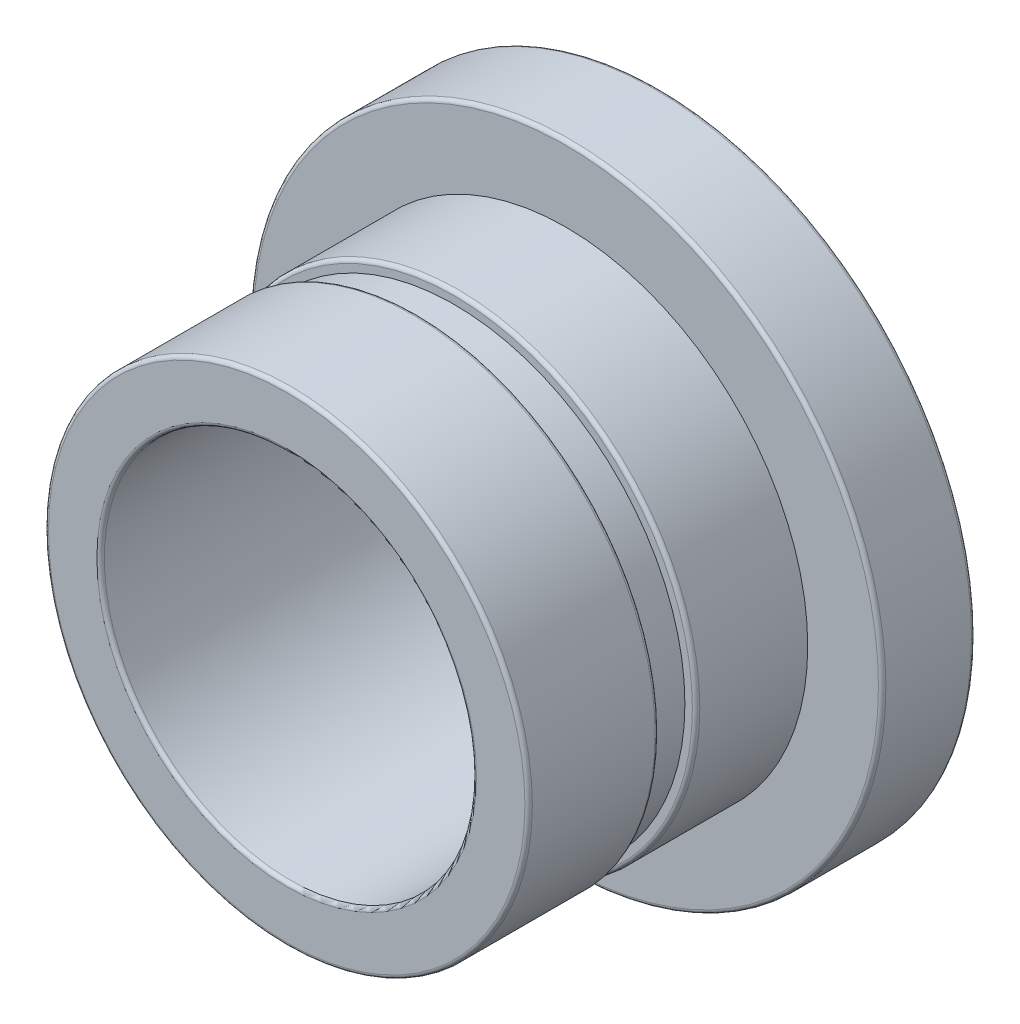
ISO-10303-21;
HEADER;
FILE_DESCRIPTION(('STEP AP214'),'2;1');
FILE_NAME('part.step','',(''),(''),'','','');
FILE_SCHEMA(('AUTOMOTIVE_DESIGN { 1 0 10303 214 1 1 1 1 }'));
ENDSEC;
DATA;
#1=APPLICATION_CONTEXT('core data for automotive mechanical design processes');
#2=APPLICATION_PROTOCOL_DEFINITION('international standard','automotive_design',2000,#1);
#3=PRODUCT_CONTEXT('',#1,'mechanical');
#4=PRODUCT('Part','Part','',(#3));
#5=PRODUCT_RELATED_PRODUCT_CATEGORY('part','',(#4));
#6=PRODUCT_DEFINITION_FORMATION('','',#4);
#7=PRODUCT_DEFINITION_CONTEXT('part definition',#1,'design');
#8=PRODUCT_DEFINITION('design','',#6,#7);
#9=PRODUCT_DEFINITION_SHAPE('','',#8);
#10=(LENGTH_UNIT() NAMED_UNIT(*) SI_UNIT(.MILLI.,.METRE.));
#11=(NAMED_UNIT(*) PLANE_ANGLE_UNIT() SI_UNIT($,.RADIAN.));
#12=(NAMED_UNIT(*) SI_UNIT($,.STERADIAN.) SOLID_ANGLE_UNIT());
#13=UNCERTAINTY_MEASURE_WITH_UNIT(LENGTH_MEASURE(1.E-05),#10,'distance_accuracy_value','');
#14=(GEOMETRIC_REPRESENTATION_CONTEXT(3) GLOBAL_UNCERTAINTY_ASSIGNED_CONTEXT((#13)) GLOBAL_UNIT_ASSIGNED_CONTEXT((#10,
#11,#12)) REPRESENTATION_CONTEXT('',''));
#15=CARTESIAN_POINT('',(0.,0.,0.));
#16=DIRECTION('',(0.,0.,1.));
#17=DIRECTION('',(1.,0.,0.));
#18=AXIS2_PLACEMENT_3D('',#15,#16,#17);
#19=CARTESIAN_POINT('',(0.,0.,10.));
#20=DIRECTION('',(0.,0.,-1.));
#21=DIRECTION('',(-1.,0.,0.));
#22=AXIS2_PLACEMENT_3D('',#19,#20,#21);
#23=CYLINDRICAL_SURFACE('',#22,6.5);
#24=CARTESIAN_POINT('',(0.,0.,5.4));
#25=DIRECTION('',(0.,0.,1.));
#26=DIRECTION('',(1.,0.,0.));
#27=AXIS2_PLACEMENT_3D('',#24,#25,#26);
#28=CIRCLE('',#27,6.5);
#29=CARTESIAN_POINT('',(6.5,0.,5.4));
#30=VERTEX_POINT('',#29);
#31=EDGE_CURVE('E10',#30,#30,#28,.F.);
#32=ORIENTED_EDGE('',*,*,#31,.T.);
#33=EDGE_LOOP('',(#32));
#34=FACE_BOUND('',#33,.T.);
#35=CARTESIAN_POINT('',(0.,0.,2.5));
#36=DIRECTION('',(0.,0.,1.));
#37=DIRECTION('',(1.,0.,0.));
#38=AXIS2_PLACEMENT_3D('',#35,#36,#37);
#39=CIRCLE('',#38,6.5);
#40=CARTESIAN_POINT('',(6.5,0.,2.5));
#41=VERTEX_POINT('',#40);
#42=EDGE_CURVE('E74',#41,#41,#39,.T.);
#43=ORIENTED_EDGE('',*,*,#42,.T.);
#44=EDGE_LOOP('',(#43));
#45=FACE_BOUND('',#44,.T.);
#46=ADVANCED_FACE('F24',(#34,#45),#23,.T.);
#47=CARTESIAN_POINT('',(0.,0.,2.5));
#48=DIRECTION('',(0.,0.,1.));
#49=DIRECTION('',(1.,0.,0.));
#50=AXIS2_PLACEMENT_3D('',#47,#48,#49);
#51=PLANE('',#50);
#52=CARTESIAN_POINT('',(0.,0.,2.5));
#53=DIRECTION('',(0.,0.,1.));
#54=DIRECTION('',(1.,0.,0.));
#55=AXIS2_PLACEMENT_3D('',#52,#53,#54);
#56=CIRCLE('',#55,8.4);
#57=CARTESIAN_POINT('',(8.4,0.,2.5));
#58=VERTEX_POINT('',#57);
#59=EDGE_CURVE('E59',#58,#58,#56,.T.);
#60=ORIENTED_EDGE('',*,*,#59,.T.);
#61=EDGE_LOOP('',(#60));
#62=FACE_BOUND('',#61,.T.);
#63=ORIENTED_EDGE('',*,*,#42,.F.);
#64=EDGE_LOOP('',(#63));
#65=FACE_BOUND('',#64,.T.);
#66=ADVANCED_FACE('F103',(#62,#65),#51,.T.);
#67=CARTESIAN_POINT('',(0.,0.,2.5));
#68=DIRECTION('',(0.,0.,-1.));
#69=DIRECTION('',(-1.,0.,0.));
#70=AXIS2_PLACEMENT_3D('',#67,#68,#69);
#71=CYLINDRICAL_SURFACE('',#70,8.5);
#72=CARTESIAN_POINT('',(0.,0.,0.0999999999999998));
#73=DIRECTION('',(0.,0.,1.));
#74=DIRECTION('',(1.,0.,0.));
#75=AXIS2_PLACEMENT_3D('',#72,#73,#74);
#76=CIRCLE('',#75,8.5);
#77=CARTESIAN_POINT('',(8.5,0.,0.0999999999999998));
#78=VERTEX_POINT('',#77);
#79=EDGE_CURVE('E68',#78,#78,#76,.T.);
#80=ORIENTED_EDGE('',*,*,#79,.T.);
#81=EDGE_LOOP('',(#80));
#82=FACE_BOUND('',#81,.T.);
#83=CARTESIAN_POINT('',(0.,0.,2.4));
#84=DIRECTION('',(0.,0.,1.));
#85=DIRECTION('',(1.,0.,0.));
#86=AXIS2_PLACEMENT_3D('',#83,#84,#85);
#87=CIRCLE('',#86,8.5);
#88=CARTESIAN_POINT('',(8.5,0.,2.4));
#89=VERTEX_POINT('',#88);
#90=EDGE_CURVE('E71',#89,#89,#87,.F.);
#91=ORIENTED_EDGE('',*,*,#90,.T.);
#92=EDGE_LOOP('',(#91));
#93=FACE_BOUND('',#92,.T.);
#94=ADVANCED_FACE('F26',(#82,#93),#71,.T.);
#95=CARTESIAN_POINT('',(0.,0.,0.));
#96=DIRECTION('',(0.,0.,1.));
#97=DIRECTION('',(1.,0.,0.));
#98=AXIS2_PLACEMENT_3D('',#95,#96,#97);
#99=PLANE('',#98);
#100=CARTESIAN_POINT('',(0.,0.,0.));
#101=DIRECTION('',(0.,0.,1.));
#102=DIRECTION('',(1.,0.,0.));
#103=AXIS2_PLACEMENT_3D('',#100,#101,#102);
#104=CIRCLE('',#103,8.4);
#105=CARTESIAN_POINT('',(8.4,0.,0.));
#106=VERTEX_POINT('',#105);
#107=EDGE_CURVE('E62',#106,#106,#104,.F.);
#108=ORIENTED_EDGE('',*,*,#107,.T.);
#109=EDGE_LOOP('',(#108));
#110=FACE_BOUND('',#109,.T.);
#111=CARTESIAN_POINT('',(0.,0.,0.));
#112=DIRECTION('',(0.,0.,1.));
#113=DIRECTION('',(1.,0.,0.));
#114=AXIS2_PLACEMENT_3D('',#111,#112,#113);
#115=CIRCLE('',#114,5.1);
#116=CARTESIAN_POINT('',(5.1,0.,0.));
#117=VERTEX_POINT('',#116);
#118=EDGE_CURVE('E65',#117,#117,#115,.T.);
#119=ORIENTED_EDGE('',*,*,#118,.T.);
#120=EDGE_LOOP('',(#119));
#121=FACE_BOUND('',#120,.T.);
#122=ADVANCED_FACE('F115',(#110,#121),#99,.F.);
#123=CARTESIAN_POINT('',(0.,0.,6.6));
#124=DIRECTION('',(0.,0.,1.));
#125=DIRECTION('',(1.,0.,0.));
#126=AXIS2_PLACEMENT_3D('',#123,#124,#125);
#127=CIRCLE('',#126,6.5);
#128=CARTESIAN_POINT('',(6.5,0.,6.6));
#129=VERTEX_POINT('',#128);
#130=EDGE_CURVE('E39',#129,#129,#127,.T.);
#131=ORIENTED_EDGE('',*,*,#130,.T.);
#132=EDGE_LOOP('',(#131));
#133=FACE_BOUND('',#132,.T.);
#134=CARTESIAN_POINT('',(0.,0.,9.9));
#135=DIRECTION('',(0.,0.,1.));
#136=DIRECTION('',(1.,0.,0.));
#137=AXIS2_PLACEMENT_3D('',#134,#135,#136);
#138=CIRCLE('',#137,6.5);
#139=CARTESIAN_POINT('',(6.5,0.,9.9));
#140=VERTEX_POINT('',#139);
#141=EDGE_CURVE('E50',#140,#140,#138,.F.);
#142=ORIENTED_EDGE('',*,*,#141,.T.);
#143=EDGE_LOOP('',(#142));
#144=FACE_BOUND('',#143,.T.);
#145=ADVANCED_FACE('F105',(#133,#144),#23,.T.);
#146=CARTESIAN_POINT('',(0.,0.,10.));
#147=DIRECTION('',(0.,0.,1.));
#148=DIRECTION('',(1.,0.,0.));
#149=AXIS2_PLACEMENT_3D('',#146,#147,#148);
#150=PLANE('',#149);
#151=CARTESIAN_POINT('',(0.,0.,10.));
#152=DIRECTION('',(0.,0.,1.));
#153=DIRECTION('',(1.,0.,0.));
#154=AXIS2_PLACEMENT_3D('',#151,#152,#153);
#155=CIRCLE('',#154,6.4);
#156=CARTESIAN_POINT('',(6.4,0.,10.));
#157=VERTEX_POINT('',#156);
#158=EDGE_CURVE('E53',#157,#157,#155,.T.);
#159=ORIENTED_EDGE('',*,*,#158,.T.);
#160=EDGE_LOOP('',(#159));
#161=FACE_BOUND('',#160,.T.);
#162=CARTESIAN_POINT('',(0.,0.,10.));
#163=DIRECTION('',(0.,0.,1.));
#164=DIRECTION('',(1.,0.,0.));
#165=AXIS2_PLACEMENT_3D('',#162,#163,#164);
#166=CIRCLE('',#165,5.1);
#167=CARTESIAN_POINT('',(5.1,0.,10.));
#168=VERTEX_POINT('',#167);
#169=EDGE_CURVE('E56',#168,#168,#166,.F.);
#170=ORIENTED_EDGE('',*,*,#169,.T.);
#171=EDGE_LOOP('',(#170));
#172=FACE_BOUND('',#171,.T.);
#173=ADVANCED_FACE('F114',(#161,#172),#150,.T.);
#174=CARTESIAN_POINT('',(0.,0.,0.));
#175=DIRECTION('',(0.,0.,1.));
#176=DIRECTION('',(1.,0.,0.));
#177=AXIS2_PLACEMENT_3D('',#174,#175,#176);
#178=CYLINDRICAL_SURFACE('',#177,5.);
#179=CARTESIAN_POINT('',(0.,0.,9.9));
#180=DIRECTION('',(0.,0.,1.));
#181=DIRECTION('',(1.,0.,0.));
#182=AXIS2_PLACEMENT_3D('',#179,#180,#181);
#183=CIRCLE('',#182,5.);
#184=CARTESIAN_POINT('',(5.,0.,9.9));
#185=VERTEX_POINT('',#184);
#186=EDGE_CURVE('E44',#185,#185,#183,.T.);
#187=ORIENTED_EDGE('',*,*,#186,.T.);
#188=EDGE_LOOP('',(#187));
#189=FACE_BOUND('',#188,.T.);
#190=CARTESIAN_POINT('',(0.,0.,0.1));
#191=DIRECTION('',(0.,0.,1.));
#192=DIRECTION('',(1.,0.,0.));
#193=AXIS2_PLACEMENT_3D('',#190,#191,#192);
#194=CIRCLE('',#193,5.);
#195=CARTESIAN_POINT('',(5.,0.,0.1));
#196=VERTEX_POINT('',#195);
#197=EDGE_CURVE('E47',#196,#196,#194,.F.);
#198=ORIENTED_EDGE('',*,*,#197,.T.);
#199=EDGE_LOOP('',(#198));
#200=FACE_BOUND('',#199,.T.);
#201=ADVANCED_FACE('F121',(#189,#200),#178,.F.);
#202=CARTESIAN_POINT('',(0.,0.,0.0999999999999998));
#203=DIRECTION('',(0.,0.,1.));
#204=DIRECTION('',(1.,0.,0.));
#205=AXIS2_PLACEMENT_3D('',#202,#203,#204);
#206=TOROIDAL_SURFACE('',#205,8.4,0.1);
#207=ORIENTED_EDGE('',*,*,#107,.F.);
#208=EDGE_LOOP('',(#207));
#209=FACE_BOUND('',#208,.T.);
#210=ORIENTED_EDGE('',*,*,#79,.F.);
#211=EDGE_LOOP('',(#210));
#212=FACE_BOUND('',#211,.T.);
#213=ADVANCED_FACE('F147',(#209,#212),#206,.T.);
#214=CARTESIAN_POINT('',(0.,0.,2.4));
#215=DIRECTION('',(0.,0.,1.));
#216=DIRECTION('',(1.,0.,0.));
#217=AXIS2_PLACEMENT_3D('',#214,#215,#216);
#218=TOROIDAL_SURFACE('',#217,8.4,0.1);
#219=ORIENTED_EDGE('',*,*,#90,.F.);
#220=EDGE_LOOP('',(#219));
#221=FACE_BOUND('',#220,.T.);
#222=ORIENTED_EDGE('',*,*,#59,.F.);
#223=EDGE_LOOP('',(#222));
#224=FACE_BOUND('',#223,.T.);
#225=ADVANCED_FACE('F133',(#221,#224),#218,.T.);
#226=CARTESIAN_POINT('',(0.,0.,9.9));
#227=DIRECTION('',(0.,0.,1.));
#228=DIRECTION('',(1.,0.,0.));
#229=AXIS2_PLACEMENT_3D('',#226,#227,#228);
#230=TOROIDAL_SURFACE('',#229,6.4,0.1);
#231=ORIENTED_EDGE('',*,*,#141,.F.);
#232=EDGE_LOOP('',(#231));
#233=FACE_BOUND('',#232,.T.);
#234=ORIENTED_EDGE('',*,*,#158,.F.);
#235=EDGE_LOOP('',(#234));
#236=FACE_BOUND('',#235,.T.);
#237=ADVANCED_FACE('F129',(#233,#236),#230,.T.);
#238=CARTESIAN_POINT('',(0.,0.,9.9));
#239=DIRECTION('',(0.,0.,1.));
#240=DIRECTION('',(1.,0.,0.));
#241=AXIS2_PLACEMENT_3D('',#238,#239,#240);
#242=TOROIDAL_SURFACE('',#241,5.1,0.1);
#243=ORIENTED_EDGE('',*,*,#169,.F.);
#244=EDGE_LOOP('',(#243));
#245=FACE_BOUND('',#244,.T.);
#246=ORIENTED_EDGE('',*,*,#186,.F.);
#247=EDGE_LOOP('',(#246));
#248=FACE_BOUND('',#247,.T.);
#249=ADVANCED_FACE('F132',(#245,#248),#242,.T.);
#250=CARTESIAN_POINT('',(0.,0.,0.1));
#251=DIRECTION('',(0.,0.,1.));
#252=DIRECTION('',(1.,0.,0.));
#253=AXIS2_PLACEMENT_3D('',#250,#251,#252);
#254=TOROIDAL_SURFACE('',#253,5.1,0.1);
#255=ORIENTED_EDGE('',*,*,#197,.F.);
#256=EDGE_LOOP('',(#255));
#257=FACE_BOUND('',#256,.T.);
#258=ORIENTED_EDGE('',*,*,#118,.F.);
#259=EDGE_LOOP('',(#258));
#260=FACE_BOUND('',#259,.T.);
#261=ADVANCED_FACE('F141',(#257,#260),#254,.T.);
#262=CARTESIAN_POINT('',(0.,0.,5.5));
#263=DIRECTION('',(0.,0.,1.));
#264=DIRECTION('',(1.,0.,0.));
#265=AXIS2_PLACEMENT_3D('',#262,#263,#264);
#266=PLANE('',#265);
#267=CARTESIAN_POINT('',(0.,0.,5.5));
#268=DIRECTION('',(0.,0.,1.));
#269=DIRECTION('',(1.,0.,0.));
#270=AXIS2_PLACEMENT_3D('',#267,#268,#269);
#271=CIRCLE('',#270,6.4);
#272=CARTESIAN_POINT('',(6.4,0.,5.5));
#273=VERTEX_POINT('',#272);
#274=EDGE_CURVE('E31',#273,#273,#271,.T.);
#275=ORIENTED_EDGE('',*,*,#274,.T.);
#276=EDGE_LOOP('',(#275));
#277=FACE_BOUND('',#276,.T.);
#278=CARTESIAN_POINT('',(0.,0.,5.5));
#279=DIRECTION('',(0.,0.,1.));
#280=DIRECTION('',(1.,0.,0.));
#281=AXIS2_PLACEMENT_3D('',#278,#279,#280);
#282=CIRCLE('',#281,6.2);
#283=CARTESIAN_POINT('',(6.2,0.,5.5));
#284=VERTEX_POINT('',#283);
#285=EDGE_CURVE('E77',#284,#284,#282,.T.);
#286=ORIENTED_EDGE('',*,*,#285,.F.);
#287=EDGE_LOOP('',(#286));
#288=FACE_BOUND('',#287,.T.);
#289=ADVANCED_FACE('F100',(#277,#288),#266,.T.);
#290=CARTESIAN_POINT('',(0.,0.,6.5));
#291=DIRECTION('',(0.,0.,1.));
#292=DIRECTION('',(1.,0.,0.));
#293=AXIS2_PLACEMENT_3D('',#290,#291,#292);
#294=PLANE('',#293);
#295=CARTESIAN_POINT('',(0.,0.,6.5));
#296=DIRECTION('',(0.,0.,1.));
#297=DIRECTION('',(1.,0.,0.));
#298=AXIS2_PLACEMENT_3D('',#295,#296,#297);
#299=CIRCLE('',#298,6.4);
#300=CARTESIAN_POINT('',(6.4,0.,6.5));
#301=VERTEX_POINT('',#300);
#302=EDGE_CURVE('E35',#301,#301,#299,.F.);
#303=ORIENTED_EDGE('',*,*,#302,.T.);
#304=EDGE_LOOP('',(#303));
#305=FACE_BOUND('',#304,.T.);
#306=CARTESIAN_POINT('',(0.,0.,6.5));
#307=DIRECTION('',(0.,0.,1.));
#308=DIRECTION('',(1.,0.,0.));
#309=AXIS2_PLACEMENT_3D('',#306,#307,#308);
#310=CIRCLE('',#309,6.2);
#311=CARTESIAN_POINT('',(6.2,0.,6.5));
#312=VERTEX_POINT('',#311);
#313=EDGE_CURVE('E80',#312,#312,#310,.T.);
#314=ORIENTED_EDGE('',*,*,#313,.T.);
#315=EDGE_LOOP('',(#314));
#316=FACE_BOUND('',#315,.T.);
#317=ADVANCED_FACE('F84',(#305,#316),#294,.F.);
#318=CARTESIAN_POINT('',(0.,0.,5.5));
#319=DIRECTION('',(0.,0.,1.));
#320=DIRECTION('',(1.,0.,0.));
#321=AXIS2_PLACEMENT_3D('',#318,#319,#320);
#322=CYLINDRICAL_SURFACE('',#321,6.2);
#323=ORIENTED_EDGE('',*,*,#285,.T.);
#324=EDGE_LOOP('',(#323));
#325=FACE_BOUND('',#324,.T.);
#326=ORIENTED_EDGE('',*,*,#313,.F.);
#327=EDGE_LOOP('',(#326));
#328=FACE_BOUND('',#327,.T.);
#329=ADVANCED_FACE('F86',(#325,#328),#322,.T.);
#330=CARTESIAN_POINT('',(0.,0.,6.6));
#331=DIRECTION('',(0.,0.,1.));
#332=DIRECTION('',(1.,0.,0.));
#333=AXIS2_PLACEMENT_3D('',#330,#331,#332);
#334=TOROIDAL_SURFACE('',#333,6.4,0.1);
#335=ORIENTED_EDGE('',*,*,#302,.F.);
#336=EDGE_LOOP('',(#335));
#337=FACE_BOUND('',#336,.T.);
#338=ORIENTED_EDGE('',*,*,#130,.F.);
#339=EDGE_LOOP('',(#338));
#340=FACE_BOUND('',#339,.T.);
#341=ADVANCED_FACE('F88',(#337,#340),#334,.T.);
#342=CARTESIAN_POINT('',(0.,0.,5.4));
#343=DIRECTION('',(0.,0.,1.));
#344=DIRECTION('',(1.,0.,0.));
#345=AXIS2_PLACEMENT_3D('',#342,#343,#344);
#346=TOROIDAL_SURFACE('',#345,6.4,0.1);
#347=ORIENTED_EDGE('',*,*,#31,.F.);
#348=EDGE_LOOP('',(#347));
#349=FACE_BOUND('',#348,.T.);
#350=ORIENTED_EDGE('',*,*,#274,.F.);
#351=EDGE_LOOP('',(#350));
#352=FACE_BOUND('',#351,.T.);
#353=ADVANCED_FACE('F96',(#349,#352),#346,.T.);
#354=CLOSED_SHELL('',(#46,#66,#94,#122,#145,#173,#201,#213,#225,#237,#249,#261,#289,#317,#329,
#341,#353));
#355=MANIFOLD_SOLID_BREP('B2',#354);
#356=ADVANCED_BREP_SHAPE_REPRESENTATION('',(#18,#355),#14);
#357=SHAPE_DEFINITION_REPRESENTATION(#9,#356);
ENDSEC;
END-ISO-10303-21;
